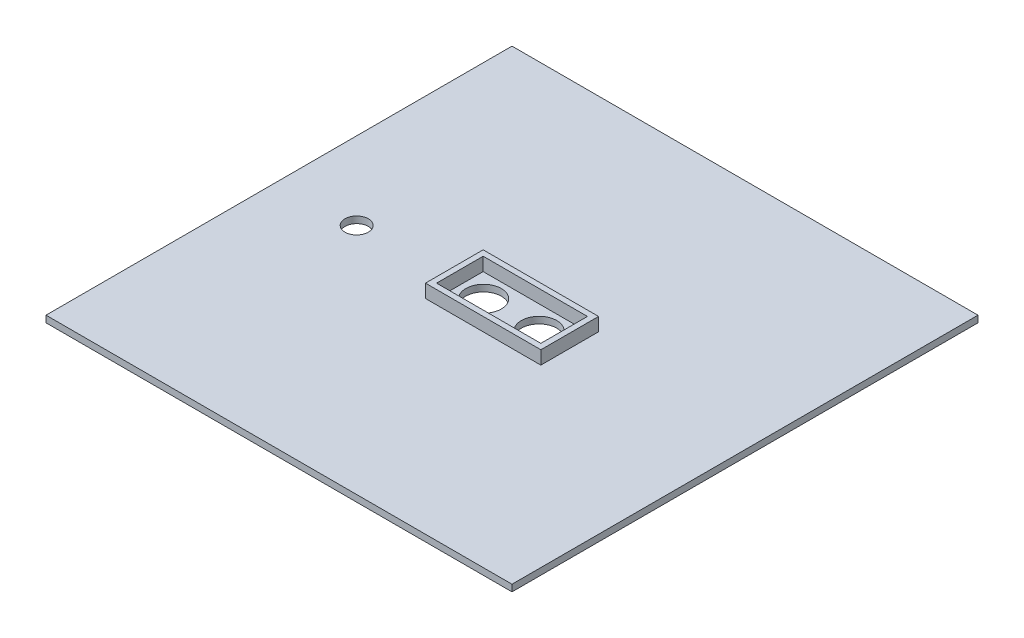
ISO-10303-21;
HEADER;
FILE_DESCRIPTION(('STEP AP214'),'2;1');
FILE_NAME('part.step','',(''),(''),'','','');
FILE_SCHEMA(('AUTOMOTIVE_DESIGN { 1 0 10303 214 1 1 1 1 }'));
ENDSEC;
DATA;
#1=APPLICATION_CONTEXT('core data for automotive mechanical design processes');
#2=APPLICATION_PROTOCOL_DEFINITION('international standard','automotive_design',2000,#1);
#3=PRODUCT_CONTEXT('',#1,'mechanical');
#4=PRODUCT('Part','Part','',(#3));
#5=PRODUCT_RELATED_PRODUCT_CATEGORY('part','',(#4));
#6=PRODUCT_DEFINITION_FORMATION('','',#4);
#7=PRODUCT_DEFINITION_CONTEXT('part definition',#1,'design');
#8=PRODUCT_DEFINITION('design','',#6,#7);
#9=PRODUCT_DEFINITION_SHAPE('','',#8);
#10=(LENGTH_UNIT() NAMED_UNIT(*) SI_UNIT(.MILLI.,.METRE.));
#11=(NAMED_UNIT(*) PLANE_ANGLE_UNIT() SI_UNIT($,.RADIAN.));
#12=(NAMED_UNIT(*) SI_UNIT($,.STERADIAN.) SOLID_ANGLE_UNIT());
#13=UNCERTAINTY_MEASURE_WITH_UNIT(LENGTH_MEASURE(1.E-05),#10,'distance_accuracy_value','');
#14=(GEOMETRIC_REPRESENTATION_CONTEXT(3) GLOBAL_UNCERTAINTY_ASSIGNED_CONTEXT((#13)) GLOBAL_UNIT_ASSIGNED_CONTEXT((#10,
#11,#12)) REPRESENTATION_CONTEXT('',''));
#15=CARTESIAN_POINT('',(0.,0.,0.));
#16=DIRECTION('',(0.,0.,1.));
#17=DIRECTION('',(1.,0.,0.));
#18=AXIS2_PLACEMENT_3D('',#15,#16,#17);
#19=CARTESIAN_POINT('',(0.,3.,0.));
#20=DIRECTION('',(0.,-1.,0.));
#21=DIRECTION('',(0.,0.,-1.));
#22=AXIS2_PLACEMENT_3D('',#19,#20,#21);
#23=PLANE('',#22);
#24=CARTESIAN_POINT('',(-70.,3.,0.));
#25=DIRECTION('',(0.,1.,0.));
#26=DIRECTION('',(0.,0.,1.));
#27=AXIS2_PLACEMENT_3D('',#24,#25,#26);
#28=CIRCLE('',#27,5.25);
#29=CARTESIAN_POINT('',(-70.,3.,5.25));
#30=VERTEX_POINT('',#29);
#31=EDGE_CURVE('E484',#30,#30,#28,.T.);
#32=ORIENTED_EDGE('',*,*,#31,.F.);
#33=EDGE_LOOP('',(#32));
#34=FACE_BOUND('',#33,.T.);
#35=DIRECTION('',(-1.,0.,0.));
#36=VECTOR('',#35,1.);
#37=CARTESIAN_POINT('',(-4.99999999999999,3.,-19.));
#38=LINE('',#37,#36);
#39=CARTESIAN_POINT('',(5.00000000000001,3.,-19.));
#40=VERTEX_POINT('',#39);
#41=CARTESIAN_POINT('',(-4.99999999999999,3.,-19.));
#42=VERTEX_POINT('',#41);
#43=EDGE_CURVE('E213',#40,#42,#38,.T.);
#44=ORIENTED_EDGE('',*,*,#43,.F.);
#45=DIRECTION('',(0.,0.,-1.));
#46=VECTOR('',#45,1.);
#47=CARTESIAN_POINT('',(5.00000000000001,3.,-15.));
#48=LINE('',#47,#46);
#49=CARTESIAN_POINT('',(5.00000000000001,3.,-15.));
#50=VERTEX_POINT('',#49);
#51=EDGE_CURVE('E55',#50,#40,#48,.T.);
#52=ORIENTED_EDGE('',*,*,#51,.F.);
#53=DIRECTION('',(1.,0.,0.));
#54=VECTOR('',#53,1.);
#55=CARTESIAN_POINT('',(-4.99999999999999,3.,-15.));
#56=LINE('',#55,#54);
#57=CARTESIAN_POINT('',(-4.99999999999999,3.,-15.));
#58=VERTEX_POINT('',#57);
#59=EDGE_CURVE('E220',#58,#50,#56,.T.);
#60=ORIENTED_EDGE('',*,*,#59,.F.);
#61=DIRECTION('',(0.,0.,1.));
#62=VECTOR('',#61,1.);
#63=CARTESIAN_POINT('',(-4.99999999999999,3.,-15.));
#64=LINE('',#63,#62);
#65=EDGE_CURVE('E203',#42,#58,#64,.T.);
#66=ORIENTED_EDGE('',*,*,#65,.F.);
#67=EDGE_LOOP('',(#44,#52,#60,#66));
#68=FACE_BOUND('',#67,.T.);
#69=DIRECTION('',(0.,0.,-1.));
#70=VECTOR('',#69,1.);
#71=CARTESIAN_POINT('',(105.,3.,105.));
#72=LINE('',#71,#70);
#73=CARTESIAN_POINT('',(105.,3.,105.));
#74=VERTEX_POINT('',#73);
#75=CARTESIAN_POINT('',(105.,3.,-105.));
#76=VERTEX_POINT('',#75);
#77=EDGE_CURVE('E419',#74,#76,#72,.T.);
#78=ORIENTED_EDGE('',*,*,#77,.T.);
#79=DIRECTION('',(-1.,0.,0.));
#80=VECTOR('',#79,1.);
#81=CARTESIAN_POINT('',(-105.,3.,-105.));
#82=LINE('',#81,#80);
#83=CARTESIAN_POINT('',(-105.,3.,-105.));
#84=VERTEX_POINT('',#83);
#85=EDGE_CURVE('E423',#76,#84,#82,.T.);
#86=ORIENTED_EDGE('',*,*,#85,.T.);
#87=DIRECTION('',(0.,0.,1.));
#88=VECTOR('',#87,1.);
#89=CARTESIAN_POINT('',(-105.,3.,105.));
#90=LINE('',#89,#88);
#91=CARTESIAN_POINT('',(-105.,3.,105.));
#92=VERTEX_POINT('',#91);
#93=EDGE_CURVE('E427',#84,#92,#90,.T.);
#94=ORIENTED_EDGE('',*,*,#93,.T.);
#95=DIRECTION('',(1.,0.,0.));
#96=VECTOR('',#95,1.);
#97=CARTESIAN_POINT('',(-105.,3.,105.));
#98=LINE('',#97,#96);
#99=EDGE_CURVE('E430',#92,#74,#98,.T.);
#100=ORIENTED_EDGE('',*,*,#99,.T.);
#101=EDGE_LOOP('',(#78,#86,#94,#100));
#102=FACE_BOUND('',#101,.T.);
#103=DIRECTION('',(0.,0.,-1.));
#104=VECTOR('',#103,1.);
#105=CARTESIAN_POINT('',(26.,3.,13.));
#106=LINE('',#105,#104);
#107=CARTESIAN_POINT('',(26.,3.,13.));
#108=VERTEX_POINT('',#107);
#109=CARTESIAN_POINT('',(26.,3.,-13.));
#110=VERTEX_POINT('',#109);
#111=EDGE_CURVE('E276',#108,#110,#106,.T.);
#112=ORIENTED_EDGE('',*,*,#111,.F.);
#113=DIRECTION('',(1.,0.,0.));
#114=VECTOR('',#113,1.);
#115=CARTESIAN_POINT('',(-26.,3.,13.));
#116=LINE('',#115,#114);
#117=CARTESIAN_POINT('',(-26.,3.,13.));
#118=VERTEX_POINT('',#117);
#119=EDGE_CURVE('E282',#118,#108,#116,.T.);
#120=ORIENTED_EDGE('',*,*,#119,.F.);
#121=DIRECTION('',(0.,0.,1.));
#122=VECTOR('',#121,1.);
#123=CARTESIAN_POINT('',(-26.,3.,13.));
#124=LINE('',#123,#122);
#125=CARTESIAN_POINT('',(-26.,3.,-13.));
#126=VERTEX_POINT('',#125);
#127=EDGE_CURVE('E299',#126,#118,#124,.T.);
#128=ORIENTED_EDGE('',*,*,#127,.F.);
#129=DIRECTION('',(-1.,0.,0.));
#130=VECTOR('',#129,1.);
#131=CARTESIAN_POINT('',(-26.,3.,-13.));
#132=LINE('',#131,#130);
#133=EDGE_CURVE('E295',#110,#126,#132,.T.);
#134=ORIENTED_EDGE('',*,*,#133,.F.);
#135=EDGE_LOOP('',(#112,#120,#128,#134));
#136=FACE_BOUND('',#135,.T.);
#137=ADVANCED_FACE('F38',(#34,#68,#102,#136),#23,.F.);
#138=CARTESIAN_POINT('',(0.,0.,0.));
#139=DIRECTION('',(0.,-1.,0.));
#140=DIRECTION('',(0.,0.,-1.));
#141=AXIS2_PLACEMENT_3D('',#138,#139,#140);
#142=PLANE('',#141);
#143=DIRECTION('',(0.,0.,-1.));
#144=VECTOR('',#143,1.);
#145=CARTESIAN_POINT('',(105.,0.,105.));
#146=LINE('',#145,#144);
#147=CARTESIAN_POINT('',(105.,0.,105.));
#148=VERTEX_POINT('',#147);
#149=CARTESIAN_POINT('',(105.,0.,-105.));
#150=VERTEX_POINT('',#149);
#151=EDGE_CURVE('E408',#148,#150,#146,.T.);
#152=ORIENTED_EDGE('',*,*,#151,.F.);
#153=DIRECTION('',(1.,0.,0.));
#154=VECTOR('',#153,1.);
#155=CARTESIAN_POINT('',(-105.,0.,105.));
#156=LINE('',#155,#154);
#157=CARTESIAN_POINT('',(-105.,0.,105.));
#158=VERTEX_POINT('',#157);
#159=EDGE_CURVE('E424',#158,#148,#156,.T.);
#160=ORIENTED_EDGE('',*,*,#159,.F.);
#161=DIRECTION('',(0.,0.,1.));
#162=VECTOR('',#161,1.);
#163=CARTESIAN_POINT('',(-105.,0.,105.));
#164=LINE('',#163,#162);
#165=CARTESIAN_POINT('',(-105.,0.,-105.));
#166=VERTEX_POINT('',#165);
#167=EDGE_CURVE('E440',#166,#158,#164,.T.);
#168=ORIENTED_EDGE('',*,*,#167,.F.);
#169=DIRECTION('',(-1.,0.,0.));
#170=VECTOR('',#169,1.);
#171=CARTESIAN_POINT('',(-105.,0.,-105.));
#172=LINE('',#171,#170);
#173=EDGE_CURVE('E437',#150,#166,#172,.T.);
#174=ORIENTED_EDGE('',*,*,#173,.F.);
#175=EDGE_LOOP('',(#152,#160,#168,#174));
#176=FACE_BOUND('',#175,.T.);
#177=DIRECTION('',(0.,0.,1.));
#178=VECTOR('',#177,1.);
#179=CARTESIAN_POINT('',(99.5,0.,0.));
#180=LINE('',#179,#178);
#181=CARTESIAN_POINT('',(99.5,0.,-99.5));
#182=VERTEX_POINT('',#181);
#183=CARTESIAN_POINT('',(99.5,0.,99.5));
#184=VERTEX_POINT('',#183);
#185=EDGE_CURVE('E382',#182,#184,#180,.T.);
#186=ORIENTED_EDGE('',*,*,#185,.F.);
#187=DIRECTION('',(1.,0.,0.));
#188=VECTOR('',#187,1.);
#189=CARTESIAN_POINT('',(0.,0.,-99.5));
#190=LINE('',#189,#188);
#191=CARTESIAN_POINT('',(-99.5,0.,-99.5));
#192=VERTEX_POINT('',#191);
#193=EDGE_CURVE('E378',#192,#182,#190,.T.);
#194=ORIENTED_EDGE('',*,*,#193,.F.);
#195=DIRECTION('',(0.,0.,1.));
#196=VECTOR('',#195,1.);
#197=CARTESIAN_POINT('',(-99.5,0.,0.));
#198=LINE('',#197,#196);
#199=CARTESIAN_POINT('',(-99.5,0.,99.5));
#200=VERTEX_POINT('',#199);
#201=EDGE_CURVE('E335',#192,#200,#198,.T.);
#202=ORIENTED_EDGE('',*,*,#201,.T.);
#203=DIRECTION('',(1.,0.,0.));
#204=VECTOR('',#203,1.);
#205=CARTESIAN_POINT('',(0.,0.,99.5));
#206=LINE('',#205,#204);
#207=EDGE_CURVE('E386',#200,#184,#206,.T.);
#208=ORIENTED_EDGE('',*,*,#207,.T.);
#209=EDGE_LOOP('',(#186,#194,#202,#208));
#210=FACE_BOUND('',#209,.T.);
#211=ADVANCED_FACE('F493',(#176,#210),#142,.T.);
#212=CARTESIAN_POINT('',(105.,3.,105.));
#213=DIRECTION('',(-1.,0.,0.));
#214=DIRECTION('',(0.,0.,1.));
#215=AXIS2_PLACEMENT_3D('',#212,#213,#214);
#216=PLANE('',#215);
#217=ORIENTED_EDGE('',*,*,#151,.T.);
#218=DIRECTION('',(0.,-1.,0.));
#219=VECTOR('',#218,1.);
#220=CARTESIAN_POINT('',(105.,3.,-105.));
#221=LINE('',#220,#219);
#222=EDGE_CURVE('E456',#76,#150,#221,.T.);
#223=ORIENTED_EDGE('',*,*,#222,.F.);
#224=ORIENTED_EDGE('',*,*,#77,.F.);
#225=DIRECTION('',(0.,-1.,0.));
#226=VECTOR('',#225,1.);
#227=CARTESIAN_POINT('',(105.,3.,105.));
#228=LINE('',#227,#226);
#229=EDGE_CURVE('E433',#74,#148,#228,.T.);
#230=ORIENTED_EDGE('',*,*,#229,.T.);
#231=EDGE_LOOP('',(#217,#223,#224,#230));
#232=FACE_BOUND('',#231,.T.);
#233=ADVANCED_FACE('F40',(#232),#216,.F.);
#234=CARTESIAN_POINT('',(-105.,3.,-105.));
#235=DIRECTION('',(0.,0.,1.));
#236=DIRECTION('',(1.,0.,0.));
#237=AXIS2_PLACEMENT_3D('',#234,#235,#236);
#238=PLANE('',#237);
#239=ORIENTED_EDGE('',*,*,#173,.T.);
#240=DIRECTION('',(0.,-1.,0.));
#241=VECTOR('',#240,1.);
#242=CARTESIAN_POINT('',(-105.,3.,-105.));
#243=LINE('',#242,#241);
#244=EDGE_CURVE('E452',#84,#166,#243,.T.);
#245=ORIENTED_EDGE('',*,*,#244,.F.);
#246=ORIENTED_EDGE('',*,*,#85,.F.);
#247=ORIENTED_EDGE('',*,*,#222,.T.);
#248=EDGE_LOOP('',(#239,#245,#246,#247));
#249=FACE_BOUND('',#248,.T.);
#250=ADVANCED_FACE('F747',(#249),#238,.F.);
#251=CARTESIAN_POINT('',(-105.,3.,105.));
#252=DIRECTION('',(1.,0.,0.));
#253=DIRECTION('',(0.,0.,-1.));
#254=AXIS2_PLACEMENT_3D('',#251,#252,#253);
#255=PLANE('',#254);
#256=ORIENTED_EDGE('',*,*,#167,.T.);
#257=DIRECTION('',(0.,-1.,0.));
#258=VECTOR('',#257,1.);
#259=CARTESIAN_POINT('',(-105.,3.,105.));
#260=LINE('',#259,#258);
#261=EDGE_CURVE('E448',#92,#158,#260,.T.);
#262=ORIENTED_EDGE('',*,*,#261,.F.);
#263=ORIENTED_EDGE('',*,*,#93,.F.);
#264=ORIENTED_EDGE('',*,*,#244,.T.);
#265=EDGE_LOOP('',(#256,#262,#263,#264));
#266=FACE_BOUND('',#265,.T.);
#267=ADVANCED_FACE('F515',(#266),#255,.F.);
#268=CARTESIAN_POINT('',(-105.,3.,105.));
#269=DIRECTION('',(0.,0.,-1.));
#270=DIRECTION('',(-1.,0.,0.));
#271=AXIS2_PLACEMENT_3D('',#268,#269,#270);
#272=PLANE('',#271);
#273=ORIENTED_EDGE('',*,*,#159,.T.);
#274=ORIENTED_EDGE('',*,*,#229,.F.);
#275=ORIENTED_EDGE('',*,*,#99,.F.);
#276=ORIENTED_EDGE('',*,*,#261,.T.);
#277=EDGE_LOOP('',(#273,#274,#275,#276));
#278=FACE_BOUND('',#277,.T.);
#279=ADVANCED_FACE('F506',(#278),#272,.F.);
#280=DIRECTION('',(1.,0.,0.));
#281=VECTOR('',#280,1.);
#282=CARTESIAN_POINT('',(-23.5,3.,10.5));
#283=LINE('',#282,#281);
#284=CARTESIAN_POINT('',(-23.5,3.,10.5));
#285=VERTEX_POINT('',#284);
#286=CARTESIAN_POINT('',(23.5,3.,10.5));
#287=VERTEX_POINT('',#286);
#288=EDGE_CURVE('E239',#285,#287,#283,.T.);
#289=ORIENTED_EDGE('',*,*,#288,.T.);
#290=DIRECTION('',(0.,0.,-1.));
#291=VECTOR('',#290,1.);
#292=CARTESIAN_POINT('',(23.5,3.,10.5));
#293=LINE('',#292,#291);
#294=CARTESIAN_POINT('',(23.5,3.,-10.5));
#295=VERTEX_POINT('',#294);
#296=EDGE_CURVE('E230',#287,#295,#293,.T.);
#297=ORIENTED_EDGE('',*,*,#296,.T.);
#298=DIRECTION('',(-1.,0.,0.));
#299=VECTOR('',#298,1.);
#300=CARTESIAN_POINT('',(-23.5,3.,-10.5));
#301=LINE('',#300,#299);
#302=CARTESIAN_POINT('',(-23.5,3.,-10.5));
#303=VERTEX_POINT('',#302);
#304=EDGE_CURVE('E253',#295,#303,#301,.T.);
#305=ORIENTED_EDGE('',*,*,#304,.T.);
#306=DIRECTION('',(0.,0.,1.));
#307=VECTOR('',#306,1.);
#308=CARTESIAN_POINT('',(-23.5,3.,10.5));
#309=LINE('',#308,#307);
#310=EDGE_CURVE('E257',#303,#285,#309,.T.);
#311=ORIENTED_EDGE('',*,*,#310,.T.);
#312=EDGE_LOOP('',(#289,#297,#305,#311));
#313=FACE_BOUND('',#312,.T.);
#314=CARTESIAN_POINT('',(-12.8052898635694,3.,0.));
#315=DIRECTION('',(0.,1.,0.));
#316=DIRECTION('',(0.,0.,1.));
#317=AXIS2_PLACEMENT_3D('',#314,#315,#316);
#318=CIRCLE('',#317,8.);
#319=CARTESIAN_POINT('',(-12.8052898635694,3.,8.));
#320=VERTEX_POINT('',#319);
#321=EDGE_CURVE('E322',#320,#320,#318,.T.);
#322=ORIENTED_EDGE('',*,*,#321,.F.);
#323=EDGE_LOOP('',(#322));
#324=FACE_BOUND('',#323,.T.);
#325=CARTESIAN_POINT('',(12.1947101364306,3.,0.));
#326=DIRECTION('',(0.,1.,0.));
#327=DIRECTION('',(0.,0.,1.));
#328=AXIS2_PLACEMENT_3D('',#325,#326,#327);
#329=CIRCLE('',#328,8.);
#330=CARTESIAN_POINT('',(12.1947101364306,3.,8.));
#331=VERTEX_POINT('',#330);
#332=EDGE_CURVE('E321',#331,#331,#329,.T.);
#333=ORIENTED_EDGE('',*,*,#332,.F.);
#334=EDGE_LOOP('',(#333));
#335=FACE_BOUND('',#334,.T.);
#336=ADVANCED_FACE('F495',(#313,#324,#335),#23,.F.);
#337=CARTESIAN_POINT('',(0.,-5.,-99.5));
#338=DIRECTION('',(0.,0.,1.));
#339=DIRECTION('',(1.,0.,0.));
#340=AXIS2_PLACEMENT_3D('',#337,#338,#339);
#341=PLANE('',#340);
#342=ORIENTED_EDGE('',*,*,#193,.T.);
#343=DIRECTION('',(0.,1.,0.));
#344=VECTOR('',#343,1.);
#345=CARTESIAN_POINT('',(99.5,-5.,-99.5));
#346=LINE('',#345,#344);
#347=CARTESIAN_POINT('',(99.5,-5.,-99.5));
#348=VERTEX_POINT('',#347);
#349=EDGE_CURVE('E404',#348,#182,#346,.T.);
#350=ORIENTED_EDGE('',*,*,#349,.F.);
#351=DIRECTION('',(1.,0.,0.));
#352=VECTOR('',#351,1.);
#353=CARTESIAN_POINT('',(0.,-5.,-99.5));
#354=LINE('',#353,#352);
#355=CARTESIAN_POINT('',(-99.5,-5.,-99.5));
#356=VERTEX_POINT('',#355);
#357=EDGE_CURVE('E345',#356,#348,#354,.T.);
#358=ORIENTED_EDGE('',*,*,#357,.F.);
#359=DIRECTION('',(0.,1.,0.));
#360=VECTOR('',#359,1.);
#361=CARTESIAN_POINT('',(-99.5,-5.,-99.5));
#362=LINE('',#361,#360);
#363=EDGE_CURVE('E391',#356,#192,#362,.T.);
#364=ORIENTED_EDGE('',*,*,#363,.T.);
#365=EDGE_LOOP('',(#342,#350,#358,#364));
#366=FACE_BOUND('',#365,.T.);
#367=ADVANCED_FACE('F505',(#366),#341,.F.);
#368=CARTESIAN_POINT('',(99.5,-5.,0.));
#369=DIRECTION('',(-1.,0.,0.));
#370=DIRECTION('',(0.,0.,1.));
#371=AXIS2_PLACEMENT_3D('',#368,#369,#370);
#372=PLANE('',#371);
#373=ORIENTED_EDGE('',*,*,#185,.T.);
#374=DIRECTION('',(0.,1.,0.));
#375=VECTOR('',#374,1.);
#376=CARTESIAN_POINT('',(99.5,-5.,99.5));
#377=LINE('',#376,#375);
#378=CARTESIAN_POINT('',(99.5,-5.,99.5));
#379=VERTEX_POINT('',#378);
#380=EDGE_CURVE('E400',#379,#184,#377,.T.);
#381=ORIENTED_EDGE('',*,*,#380,.F.);
#382=DIRECTION('',(0.,0.,1.));
#383=VECTOR('',#382,1.);
#384=CARTESIAN_POINT('',(99.5,-5.,0.));
#385=LINE('',#384,#383);
#386=EDGE_CURVE('E349',#348,#379,#385,.T.);
#387=ORIENTED_EDGE('',*,*,#386,.F.);
#388=ORIENTED_EDGE('',*,*,#349,.T.);
#389=EDGE_LOOP('',(#373,#381,#387,#388));
#390=FACE_BOUND('',#389,.T.);
#391=ADVANCED_FACE('F512',(#390),#372,.F.);
#392=CARTESIAN_POINT('',(0.,-5.,99.5));
#393=DIRECTION('',(0.,0.,1.));
#394=DIRECTION('',(1.,0.,0.));
#395=AXIS2_PLACEMENT_3D('',#392,#393,#394);
#396=PLANE('',#395);
#397=ORIENTED_EDGE('',*,*,#207,.F.);
#398=DIRECTION('',(0.,1.,0.));
#399=VECTOR('',#398,1.);
#400=CARTESIAN_POINT('',(-99.5,-5.,99.5));
#401=LINE('',#400,#399);
#402=CARTESIAN_POINT('',(-99.5,-5.,99.5));
#403=VERTEX_POINT('',#402);
#404=EDGE_CURVE('E395',#403,#200,#401,.T.);
#405=ORIENTED_EDGE('',*,*,#404,.F.);
#406=DIRECTION('',(1.,0.,0.));
#407=VECTOR('',#406,1.);
#408=CARTESIAN_POINT('',(0.,-5.,99.5));
#409=LINE('',#408,#407);
#410=EDGE_CURVE('E352',#403,#379,#409,.T.);
#411=ORIENTED_EDGE('',*,*,#410,.T.);
#412=ORIENTED_EDGE('',*,*,#380,.T.);
#413=EDGE_LOOP('',(#397,#405,#411,#412));
#414=FACE_BOUND('',#413,.T.);
#415=ADVANCED_FACE('F548',(#414),#396,.T.);
#416=CARTESIAN_POINT('',(96.4999999999999,-5.,0.));
#417=DIRECTION('',(-1.,0.,0.));
#418=DIRECTION('',(0.,0.,1.));
#419=AXIS2_PLACEMENT_3D('',#416,#417,#418);
#420=PLANE('',#419);
#421=DIRECTION('',(0.,0.,1.));
#422=VECTOR('',#421,1.);
#423=CARTESIAN_POINT('',(96.4999999999999,0.,0.));
#424=LINE('',#423,#422);
#425=CARTESIAN_POINT('',(96.4999999999999,0.,-96.5));
#426=VERTEX_POINT('',#425);
#427=CARTESIAN_POINT('',(96.4999999999999,0.,96.5));
#428=VERTEX_POINT('',#427);
#429=EDGE_CURVE('E361',#426,#428,#424,.T.);
#430=ORIENTED_EDGE('',*,*,#429,.F.);
#431=DIRECTION('',(0.,1.,0.));
#432=VECTOR('',#431,1.);
#433=CARTESIAN_POINT('',(96.4999999999999,-5.,-96.5));
#434=LINE('',#433,#432);
#435=CARTESIAN_POINT('',(96.4999999999999,-5.,-96.5));
#436=VERTEX_POINT('',#435);
#437=EDGE_CURVE('E396',#436,#426,#434,.T.);
#438=ORIENTED_EDGE('',*,*,#437,.F.);
#439=DIRECTION('',(0.,0.,1.));
#440=VECTOR('',#439,1.);
#441=CARTESIAN_POINT('',(96.4999999999999,-5.,0.));
#442=LINE('',#441,#440);
#443=CARTESIAN_POINT('',(96.4999999999999,-5.,96.5));
#444=VERTEX_POINT('',#443);
#445=EDGE_CURVE('E330',#436,#444,#442,.T.);
#446=ORIENTED_EDGE('',*,*,#445,.T.);
#447=DIRECTION('',(0.,1.,0.));
#448=VECTOR('',#447,1.);
#449=CARTESIAN_POINT('',(96.4999999999999,-5.,96.5));
#450=LINE('',#449,#448);
#451=EDGE_CURVE('E360',#444,#428,#450,.T.);
#452=ORIENTED_EDGE('',*,*,#451,.T.);
#453=EDGE_LOOP('',(#430,#438,#446,#452));
#454=FACE_BOUND('',#453,.T.);
#455=ADVANCED_FACE('F551',(#454),#420,.T.);
#456=CARTESIAN_POINT('',(0.,-5.,-96.5));
#457=DIRECTION('',(0.,0.,1.));
#458=DIRECTION('',(1.,0.,0.));
#459=AXIS2_PLACEMENT_3D('',#456,#457,#458);
#460=PLANE('',#459);
#461=DIRECTION('',(1.,0.,0.));
#462=VECTOR('',#461,1.);
#463=CARTESIAN_POINT('',(0.,0.,-96.5));
#464=LINE('',#463,#462);
#465=CARTESIAN_POINT('',(-96.5000000000001,0.,-96.5));
#466=VERTEX_POINT('',#465);
#467=EDGE_CURVE('E365',#466,#426,#464,.T.);
#468=ORIENTED_EDGE('',*,*,#467,.F.);
#469=DIRECTION('',(0.,1.,0.));
#470=VECTOR('',#469,1.);
#471=CARTESIAN_POINT('',(-96.5000000000001,-5.,-96.5));
#472=LINE('',#471,#470);
#473=CARTESIAN_POINT('',(-96.5000000000001,-5.,-96.5));
#474=VERTEX_POINT('',#473);
#475=EDGE_CURVE('E414',#474,#466,#472,.T.);
#476=ORIENTED_EDGE('',*,*,#475,.F.);
#477=DIRECTION('',(1.,0.,0.));
#478=VECTOR('',#477,1.);
#479=CARTESIAN_POINT('',(0.,-5.,-96.5));
#480=LINE('',#479,#478);
#481=EDGE_CURVE('E334',#474,#436,#480,.T.);
#482=ORIENTED_EDGE('',*,*,#481,.T.);
#483=ORIENTED_EDGE('',*,*,#437,.T.);
#484=EDGE_LOOP('',(#468,#476,#482,#483));
#485=FACE_BOUND('',#484,.T.);
#486=ADVANCED_FACE('F562',(#485),#460,.T.);
#487=CARTESIAN_POINT('',(-96.5000000000001,-5.,0.));
#488=DIRECTION('',(-1.,0.,0.));
#489=DIRECTION('',(0.,0.,1.));
#490=AXIS2_PLACEMENT_3D('',#487,#488,#489);
#491=PLANE('',#490);
#492=DIRECTION('',(0.,0.,1.));
#493=VECTOR('',#492,1.);
#494=CARTESIAN_POINT('',(-96.5000000000001,0.,0.));
#495=LINE('',#494,#493);
#496=CARTESIAN_POINT('',(-96.5000000000001,0.,96.5));
#497=VERTEX_POINT('',#496);
#498=EDGE_CURVE('E370',#466,#497,#495,.T.);
#499=ORIENTED_EDGE('',*,*,#498,.T.);
#500=DIRECTION('',(0.,1.,0.));
#501=VECTOR('',#500,1.);
#502=CARTESIAN_POINT('',(-96.5000000000001,-5.,96.5));
#503=LINE('',#502,#501);
#504=CARTESIAN_POINT('',(-96.5000000000001,-5.,96.5));
#505=VERTEX_POINT('',#504);
#506=EDGE_CURVE('E411',#505,#497,#503,.T.);
#507=ORIENTED_EDGE('',*,*,#506,.F.);
#508=DIRECTION('',(0.,0.,1.));
#509=VECTOR('',#508,1.);
#510=CARTESIAN_POINT('',(-96.5000000000001,-5.,0.));
#511=LINE('',#510,#509);
#512=EDGE_CURVE('E339',#474,#505,#511,.T.);
#513=ORIENTED_EDGE('',*,*,#512,.F.);
#514=ORIENTED_EDGE('',*,*,#475,.T.);
#515=EDGE_LOOP('',(#499,#507,#513,#514));
#516=FACE_BOUND('',#515,.T.);
#517=ADVANCED_FACE('F558',(#516),#491,.F.);
#518=CARTESIAN_POINT('',(0.,-5.,96.5));
#519=DIRECTION('',(0.,0.,1.));
#520=DIRECTION('',(1.,0.,0.));
#521=AXIS2_PLACEMENT_3D('',#518,#519,#520);
#522=PLANE('',#521);
#523=DIRECTION('',(1.,0.,0.));
#524=VECTOR('',#523,1.);
#525=CARTESIAN_POINT('',(0.,0.,96.5));
#526=LINE('',#525,#524);
#527=EDGE_CURVE('E374',#497,#428,#526,.T.);
#528=ORIENTED_EDGE('',*,*,#527,.T.);
#529=ORIENTED_EDGE('',*,*,#451,.F.);
#530=DIRECTION('',(1.,0.,0.));
#531=VECTOR('',#530,1.);
#532=CARTESIAN_POINT('',(0.,-5.,96.5));
#533=LINE('',#532,#531);
#534=EDGE_CURVE('E342',#505,#444,#533,.T.);
#535=ORIENTED_EDGE('',*,*,#534,.F.);
#536=ORIENTED_EDGE('',*,*,#506,.T.);
#537=EDGE_LOOP('',(#528,#529,#535,#536));
#538=FACE_BOUND('',#537,.T.);
#539=ADVANCED_FACE('F546',(#538),#522,.F.);
#540=CARTESIAN_POINT('',(-99.5,-5.,0.));
#541=DIRECTION('',(-1.,0.,0.));
#542=DIRECTION('',(0.,0.,1.));
#543=AXIS2_PLACEMENT_3D('',#540,#541,#542);
#544=PLANE('',#543);
#545=ORIENTED_EDGE('',*,*,#201,.F.);
#546=ORIENTED_EDGE('',*,*,#363,.F.);
#547=DIRECTION('',(0.,0.,1.));
#548=VECTOR('',#547,1.);
#549=CARTESIAN_POINT('',(-99.5,-5.,0.));
#550=LINE('',#549,#548);
#551=EDGE_CURVE('E356',#356,#403,#550,.T.);
#552=ORIENTED_EDGE('',*,*,#551,.T.);
#553=ORIENTED_EDGE('',*,*,#404,.T.);
#554=EDGE_LOOP('',(#545,#546,#552,#553));
#555=FACE_BOUND('',#554,.T.);
#556=ADVANCED_FACE('F542',(#555),#544,.T.);
#557=CARTESIAN_POINT('',(0.,-5.,0.));
#558=DIRECTION('',(0.,-1.,0.));
#559=DIRECTION('',(0.,0.,-1.));
#560=AXIS2_PLACEMENT_3D('',#557,#558,#559);
#561=PLANE('',#560);
#562=ORIENTED_EDGE('',*,*,#445,.F.);
#563=ORIENTED_EDGE('',*,*,#481,.F.);
#564=ORIENTED_EDGE('',*,*,#512,.T.);
#565=ORIENTED_EDGE('',*,*,#534,.T.);
#566=EDGE_LOOP('',(#562,#563,#564,#565));
#567=FACE_BOUND('',#566,.T.);
#568=ORIENTED_EDGE('',*,*,#357,.T.);
#569=ORIENTED_EDGE('',*,*,#386,.T.);
#570=ORIENTED_EDGE('',*,*,#410,.F.);
#571=ORIENTED_EDGE('',*,*,#551,.F.);
#572=EDGE_LOOP('',(#568,#569,#570,#571));
#573=FACE_BOUND('',#572,.T.);
#574=ADVANCED_FACE('F536',(#567,#573),#561,.T.);
#575=CARTESIAN_POINT('',(-70.,0.,0.));
#576=DIRECTION('',(0.,-1.,0.));
#577=DIRECTION('',(0.,0.,-1.));
#578=AXIS2_PLACEMENT_3D('',#575,#576,#577);
#579=CIRCLE('',#578,5.25);
#580=CARTESIAN_POINT('',(-70.,0.,-5.25));
#581=VERTEX_POINT('',#580);
#582=EDGE_CURVE('E42',#581,#581,#579,.T.);
#583=ORIENTED_EDGE('',*,*,#582,.F.);
#584=EDGE_LOOP('',(#583));
#585=FACE_BOUND('',#584,.T.);
#586=DIRECTION('',(0.,0.,1.));
#587=VECTOR('',#586,1.);
#588=CARTESIAN_POINT('',(5.00000000000001,0.,0.));
#589=LINE('',#588,#587);
#590=CARTESIAN_POINT('',(5.00000000000001,0.,-19.));
#591=VERTEX_POINT('',#590);
#592=CARTESIAN_POINT('',(5.00000000000001,0.,-15.));
#593=VERTEX_POINT('',#592);
#594=EDGE_CURVE('E11',#591,#593,#589,.T.);
#595=ORIENTED_EDGE('',*,*,#594,.F.);
#596=DIRECTION('',(1.,0.,0.));
#597=VECTOR('',#596,1.);
#598=CARTESIAN_POINT('',(0.,0.,-19.));
#599=LINE('',#598,#597);
#600=CARTESIAN_POINT('',(-4.99999999999999,0.,-19.));
#601=VERTEX_POINT('',#600);
#602=EDGE_CURVE('E460',#601,#591,#599,.T.);
#603=ORIENTED_EDGE('',*,*,#602,.F.);
#604=DIRECTION('',(0.,0.,-1.));
#605=VECTOR('',#604,1.);
#606=CARTESIAN_POINT('',(-4.99999999999999,0.,0.));
#607=LINE('',#606,#605);
#608=CARTESIAN_POINT('',(-4.99999999999999,0.,-15.));
#609=VERTEX_POINT('',#608);
#610=EDGE_CURVE('E206',#609,#601,#607,.T.);
#611=ORIENTED_EDGE('',*,*,#610,.F.);
#612=DIRECTION('',(-1.,0.,0.));
#613=VECTOR('',#612,1.);
#614=CARTESIAN_POINT('',(0.,0.,-15.));
#615=LINE('',#614,#613);
#616=EDGE_CURVE('E48',#593,#609,#615,.T.);
#617=ORIENTED_EDGE('',*,*,#616,.F.);
#618=EDGE_LOOP('',(#595,#603,#611,#617));
#619=FACE_BOUND('',#618,.T.);
#620=CARTESIAN_POINT('',(-12.8052898635694,0.,0.));
#621=DIRECTION('',(0.,-1.,0.));
#622=DIRECTION('',(0.,0.,-1.));
#623=AXIS2_PLACEMENT_3D('',#620,#621,#622);
#624=CIRCLE('',#623,8.);
#625=CARTESIAN_POINT('',(-12.8052898635694,0.,-8.));
#626=VERTEX_POINT('',#625);
#627=EDGE_CURVE('E366',#626,#626,#624,.T.);
#628=ORIENTED_EDGE('',*,*,#627,.F.);
#629=EDGE_LOOP('',(#628));
#630=FACE_BOUND('',#629,.T.);
#631=CARTESIAN_POINT('',(12.1947101364306,0.,0.));
#632=DIRECTION('',(0.,-1.,0.));
#633=DIRECTION('',(0.,0.,-1.));
#634=AXIS2_PLACEMENT_3D('',#631,#632,#633);
#635=CIRCLE('',#634,8.);
#636=CARTESIAN_POINT('',(12.1947101364306,0.,-8.));
#637=VERTEX_POINT('',#636);
#638=EDGE_CURVE('E326',#637,#637,#635,.T.);
#639=ORIENTED_EDGE('',*,*,#638,.F.);
#640=EDGE_LOOP('',(#639));
#641=FACE_BOUND('',#640,.T.);
#642=ORIENTED_EDGE('',*,*,#429,.T.);
#643=ORIENTED_EDGE('',*,*,#527,.F.);
#644=ORIENTED_EDGE('',*,*,#498,.F.);
#645=ORIENTED_EDGE('',*,*,#467,.T.);
#646=EDGE_LOOP('',(#642,#643,#644,#645));
#647=FACE_BOUND('',#646,.T.);
#648=ADVANCED_FACE('F478',(#585,#619,#630,#641,#647),#142,.T.);
#649=CARTESIAN_POINT('',(12.1947101364306,-5.,0.));
#650=DIRECTION('',(0.,1.,0.));
#651=DIRECTION('',(0.,0.,1.));
#652=AXIS2_PLACEMENT_3D('',#649,#650,#651);
#653=CYLINDRICAL_SURFACE('',#652,8.);
#654=ORIENTED_EDGE('',*,*,#638,.T.);
#655=EDGE_LOOP('',(#654));
#656=FACE_BOUND('',#655,.T.);
#657=ORIENTED_EDGE('',*,*,#332,.T.);
#658=EDGE_LOOP('',(#657));
#659=FACE_BOUND('',#658,.T.);
#660=ADVANCED_FACE('F524',(#656,#659),#653,.F.);
#661=CARTESIAN_POINT('',(-12.8052898635694,-5.,0.));
#662=DIRECTION('',(0.,1.,0.));
#663=DIRECTION('',(0.,0.,1.));
#664=AXIS2_PLACEMENT_3D('',#661,#662,#663);
#665=CYLINDRICAL_SURFACE('',#664,8.);
#666=ORIENTED_EDGE('',*,*,#627,.T.);
#667=EDGE_LOOP('',(#666));
#668=FACE_BOUND('',#667,.T.);
#669=ORIENTED_EDGE('',*,*,#321,.T.);
#670=EDGE_LOOP('',(#669));
#671=FACE_BOUND('',#670,.T.);
#672=ADVANCED_FACE('F526',(#668,#671),#665,.F.);
#673=CARTESIAN_POINT('',(0.,9.,0.));
#674=DIRECTION('',(0.,-1.,0.));
#675=DIRECTION('',(0.,0.,-1.));
#676=AXIS2_PLACEMENT_3D('',#673,#674,#675);
#677=PLANE('',#676);
#678=DIRECTION('',(0.,0.,-1.));
#679=VECTOR('',#678,1.);
#680=CARTESIAN_POINT('',(26.,9.,13.));
#681=LINE('',#680,#679);
#682=CARTESIAN_POINT('',(26.,9.,13.));
#683=VERTEX_POINT('',#682);
#684=CARTESIAN_POINT('',(26.,9.,-13.));
#685=VERTEX_POINT('',#684);
#686=EDGE_CURVE('E277',#683,#685,#681,.T.);
#687=ORIENTED_EDGE('',*,*,#686,.T.);
#688=DIRECTION('',(-1.,0.,0.));
#689=VECTOR('',#688,1.);
#690=CARTESIAN_POINT('',(-26.,9.,-13.));
#691=LINE('',#690,#689);
#692=CARTESIAN_POINT('',(-26.,9.,-13.));
#693=VERTEX_POINT('',#692);
#694=EDGE_CURVE('E281',#685,#693,#691,.T.);
#695=ORIENTED_EDGE('',*,*,#694,.T.);
#696=DIRECTION('',(0.,0.,1.));
#697=VECTOR('',#696,1.);
#698=CARTESIAN_POINT('',(-26.,9.,13.));
#699=LINE('',#698,#697);
#700=CARTESIAN_POINT('',(-26.,9.,13.));
#701=VERTEX_POINT('',#700);
#702=EDGE_CURVE('E285',#693,#701,#699,.T.);
#703=ORIENTED_EDGE('',*,*,#702,.T.);
#704=DIRECTION('',(1.,0.,0.));
#705=VECTOR('',#704,1.);
#706=CARTESIAN_POINT('',(-26.,9.,13.));
#707=LINE('',#706,#705);
#708=EDGE_CURVE('E288',#701,#683,#707,.T.);
#709=ORIENTED_EDGE('',*,*,#708,.T.);
#710=EDGE_LOOP('',(#687,#695,#703,#709));
#711=FACE_BOUND('',#710,.T.);
#712=DIRECTION('',(0.,0.,-1.));
#713=VECTOR('',#712,1.);
#714=CARTESIAN_POINT('',(23.5,9.,10.5));
#715=LINE('',#714,#713);
#716=CARTESIAN_POINT('',(23.5,9.,10.5));
#717=VERTEX_POINT('',#716);
#718=CARTESIAN_POINT('',(23.5,9.,-10.5));
#719=VERTEX_POINT('',#718);
#720=EDGE_CURVE('E235',#717,#719,#715,.T.);
#721=ORIENTED_EDGE('',*,*,#720,.F.);
#722=DIRECTION('',(1.,0.,0.));
#723=VECTOR('',#722,1.);
#724=CARTESIAN_POINT('',(-23.5,9.,10.5));
#725=LINE('',#724,#723);
#726=CARTESIAN_POINT('',(-23.5,9.,10.5));
#727=VERTEX_POINT('',#726);
#728=EDGE_CURVE('E246',#727,#717,#725,.T.);
#729=ORIENTED_EDGE('',*,*,#728,.F.);
#730=DIRECTION('',(0.,0.,1.));
#731=VECTOR('',#730,1.);
#732=CARTESIAN_POINT('',(-23.5,9.,10.5));
#733=LINE('',#732,#731);
#734=CARTESIAN_POINT('',(-23.5,9.,-10.5));
#735=VERTEX_POINT('',#734);
#736=EDGE_CURVE('E242',#735,#727,#733,.T.);
#737=ORIENTED_EDGE('',*,*,#736,.F.);
#738=DIRECTION('',(-1.,0.,0.));
#739=VECTOR('',#738,1.);
#740=CARTESIAN_POINT('',(-23.5,9.,-10.5));
#741=LINE('',#740,#739);
#742=EDGE_CURVE('E238',#719,#735,#741,.T.);
#743=ORIENTED_EDGE('',*,*,#742,.F.);
#744=EDGE_LOOP('',(#721,#729,#737,#743));
#745=FACE_BOUND('',#744,.T.);
#746=ADVANCED_FACE('F533',(#711,#745),#677,.F.);
#747=CARTESIAN_POINT('',(26.,9.,13.));
#748=DIRECTION('',(-1.,0.,0.));
#749=DIRECTION('',(0.,0.,1.));
#750=AXIS2_PLACEMENT_3D('',#747,#748,#749);
#751=PLANE('',#750);
#752=ORIENTED_EDGE('',*,*,#111,.T.);
#753=DIRECTION('',(0.,-1.,0.));
#754=VECTOR('',#753,1.);
#755=CARTESIAN_POINT('',(26.,9.,-13.));
#756=LINE('',#755,#754);
#757=EDGE_CURVE('E317',#685,#110,#756,.T.);
#758=ORIENTED_EDGE('',*,*,#757,.F.);
#759=ORIENTED_EDGE('',*,*,#686,.F.);
#760=DIRECTION('',(0.,-1.,0.));
#761=VECTOR('',#760,1.);
#762=CARTESIAN_POINT('',(26.,9.,13.));
#763=LINE('',#762,#761);
#764=EDGE_CURVE('E291',#683,#108,#763,.T.);
#765=ORIENTED_EDGE('',*,*,#764,.T.);
#766=EDGE_LOOP('',(#752,#758,#759,#765));
#767=FACE_BOUND('',#766,.T.);
#768=ADVANCED_FACE('F706',(#767),#751,.F.);
#769=CARTESIAN_POINT('',(-26.,9.,-13.));
#770=DIRECTION('',(0.,0.,1.));
#771=DIRECTION('',(1.,0.,0.));
#772=AXIS2_PLACEMENT_3D('',#769,#770,#771);
#773=PLANE('',#772);
#774=ORIENTED_EDGE('',*,*,#133,.T.);
#775=DIRECTION('',(0.,-1.,0.));
#776=VECTOR('',#775,1.);
#777=CARTESIAN_POINT('',(-26.,9.,-13.));
#778=LINE('',#777,#776);
#779=EDGE_CURVE('E313',#693,#126,#778,.T.);
#780=ORIENTED_EDGE('',*,*,#779,.F.);
#781=ORIENTED_EDGE('',*,*,#694,.F.);
#782=ORIENTED_EDGE('',*,*,#757,.T.);
#783=EDGE_LOOP('',(#774,#780,#781,#782));
#784=FACE_BOUND('',#783,.T.);
#785=ADVANCED_FACE('F698',(#784),#773,.F.);
#786=CARTESIAN_POINT('',(-26.,9.,13.));
#787=DIRECTION('',(1.,0.,0.));
#788=DIRECTION('',(0.,0.,-1.));
#789=AXIS2_PLACEMENT_3D('',#786,#787,#788);
#790=PLANE('',#789);
#791=ORIENTED_EDGE('',*,*,#127,.T.);
#792=DIRECTION('',(0.,-1.,0.));
#793=VECTOR('',#792,1.);
#794=CARTESIAN_POINT('',(-26.,9.,13.));
#795=LINE('',#794,#793);
#796=EDGE_CURVE('E309',#701,#118,#795,.T.);
#797=ORIENTED_EDGE('',*,*,#796,.F.);
#798=ORIENTED_EDGE('',*,*,#702,.F.);
#799=ORIENTED_EDGE('',*,*,#779,.T.);
#800=EDGE_LOOP('',(#791,#797,#798,#799));
#801=FACE_BOUND('',#800,.T.);
#802=ADVANCED_FACE('F690',(#801),#790,.F.);
#803=CARTESIAN_POINT('',(-26.,9.,13.));
#804=DIRECTION('',(0.,0.,-1.));
#805=DIRECTION('',(-1.,0.,0.));
#806=AXIS2_PLACEMENT_3D('',#803,#804,#805);
#807=PLANE('',#806);
#808=ORIENTED_EDGE('',*,*,#119,.T.);
#809=ORIENTED_EDGE('',*,*,#764,.F.);
#810=ORIENTED_EDGE('',*,*,#708,.F.);
#811=ORIENTED_EDGE('',*,*,#796,.T.);
#812=EDGE_LOOP('',(#808,#809,#810,#811));
#813=FACE_BOUND('',#812,.T.);
#814=ADVANCED_FACE('F682',(#813),#807,.F.);
#815=CARTESIAN_POINT('',(23.5,9.,10.5));
#816=DIRECTION('',(-1.,0.,0.));
#817=DIRECTION('',(0.,0.,1.));
#818=AXIS2_PLACEMENT_3D('',#815,#816,#817);
#819=PLANE('',#818);
#820=ORIENTED_EDGE('',*,*,#296,.F.);
#821=DIRECTION('',(0.,-1.,0.));
#822=VECTOR('',#821,1.);
#823=CARTESIAN_POINT('',(23.5,9.,10.5));
#824=LINE('',#823,#822);
#825=EDGE_CURVE('E249',#717,#287,#824,.T.);
#826=ORIENTED_EDGE('',*,*,#825,.F.);
#827=ORIENTED_EDGE('',*,*,#720,.T.);
#828=DIRECTION('',(0.,-1.,0.));
#829=VECTOR('',#828,1.);
#830=CARTESIAN_POINT('',(23.5,9.,-10.5));
#831=LINE('',#830,#829);
#832=EDGE_CURVE('E272',#719,#295,#831,.T.);
#833=ORIENTED_EDGE('',*,*,#832,.T.);
#834=EDGE_LOOP('',(#820,#826,#827,#833));
#835=FACE_BOUND('',#834,.T.);
#836=ADVANCED_FACE('F674',(#835),#819,.T.);
#837=CARTESIAN_POINT('',(-23.5,9.,-10.5));
#838=DIRECTION('',(0.,0.,1.));
#839=DIRECTION('',(1.,0.,0.));
#840=AXIS2_PLACEMENT_3D('',#837,#838,#839);
#841=PLANE('',#840);
#842=ORIENTED_EDGE('',*,*,#304,.F.);
#843=ORIENTED_EDGE('',*,*,#832,.F.);
#844=ORIENTED_EDGE('',*,*,#742,.T.);
#845=DIRECTION('',(0.,-1.,0.));
#846=VECTOR('',#845,1.);
#847=CARTESIAN_POINT('',(-23.5,9.,-10.5));
#848=LINE('',#847,#846);
#849=EDGE_CURVE('E269',#735,#303,#848,.T.);
#850=ORIENTED_EDGE('',*,*,#849,.T.);
#851=EDGE_LOOP('',(#842,#843,#844,#850));
#852=FACE_BOUND('',#851,.T.);
#853=ADVANCED_FACE('F666',(#852),#841,.T.);
#854=CARTESIAN_POINT('',(-23.5,9.,10.5));
#855=DIRECTION('',(1.,0.,0.));
#856=DIRECTION('',(0.,0.,-1.));
#857=AXIS2_PLACEMENT_3D('',#854,#855,#856);
#858=PLANE('',#857);
#859=ORIENTED_EDGE('',*,*,#310,.F.);
#860=ORIENTED_EDGE('',*,*,#849,.F.);
#861=ORIENTED_EDGE('',*,*,#736,.T.);
#862=DIRECTION('',(0.,-1.,0.));
#863=VECTOR('',#862,1.);
#864=CARTESIAN_POINT('',(-23.5,9.,10.5));
#865=LINE('',#864,#863);
#866=EDGE_CURVE('E266',#727,#285,#865,.T.);
#867=ORIENTED_EDGE('',*,*,#866,.T.);
#868=EDGE_LOOP('',(#859,#860,#861,#867));
#869=FACE_BOUND('',#868,.T.);
#870=ADVANCED_FACE('F658',(#869),#858,.T.);
#871=CARTESIAN_POINT('',(-23.5,9.,10.5));
#872=DIRECTION('',(0.,0.,-1.));
#873=DIRECTION('',(-1.,0.,0.));
#874=AXIS2_PLACEMENT_3D('',#871,#872,#873);
#875=PLANE('',#874);
#876=ORIENTED_EDGE('',*,*,#288,.F.);
#877=ORIENTED_EDGE('',*,*,#866,.F.);
#878=ORIENTED_EDGE('',*,*,#728,.T.);
#879=ORIENTED_EDGE('',*,*,#825,.T.);
#880=EDGE_LOOP('',(#876,#877,#878,#879));
#881=FACE_BOUND('',#880,.T.);
#882=ADVANCED_FACE('F651',(#881),#875,.T.);
#883=CARTESIAN_POINT('',(5.00000000000001,-5.,-15.));
#884=DIRECTION('',(1.,0.,0.));
#885=DIRECTION('',(0.,0.,-1.));
#886=AXIS2_PLACEMENT_3D('',#883,#884,#885);
#887=PLANE('',#886);
#888=ORIENTED_EDGE('',*,*,#594,.T.);
#889=DIRECTION('',(0.,1.,0.));
#890=VECTOR('',#889,1.);
#891=CARTESIAN_POINT('',(5.00000000000001,-5.,-15.));
#892=LINE('',#891,#890);
#893=EDGE_CURVE('E227',#593,#50,#892,.T.);
#894=ORIENTED_EDGE('',*,*,#893,.T.);
#895=ORIENTED_EDGE('',*,*,#51,.T.);
#896=DIRECTION('',(0.,1.,0.));
#897=VECTOR('',#896,1.);
#898=CARTESIAN_POINT('',(5.00000000000001,-5.,-19.));
#899=LINE('',#898,#897);
#900=EDGE_CURVE('E210',#591,#40,#899,.T.);
#901=ORIENTED_EDGE('',*,*,#900,.F.);
#902=EDGE_LOOP('',(#888,#894,#895,#901));
#903=FACE_BOUND('',#902,.T.);
#904=ADVANCED_FACE('F480',(#903),#887,.F.);
#905=CARTESIAN_POINT('',(-4.99999999999999,-5.,-15.));
#906=DIRECTION('',(0.,0.,1.));
#907=DIRECTION('',(1.,0.,0.));
#908=AXIS2_PLACEMENT_3D('',#905,#906,#907);
#909=PLANE('',#908);
#910=ORIENTED_EDGE('',*,*,#616,.T.);
#911=DIRECTION('',(0.,1.,0.));
#912=VECTOR('',#911,1.);
#913=CARTESIAN_POINT('',(-4.99999999999999,-5.,-15.));
#914=LINE('',#913,#912);
#915=EDGE_CURVE('E209',#609,#58,#914,.T.);
#916=ORIENTED_EDGE('',*,*,#915,.T.);
#917=ORIENTED_EDGE('',*,*,#59,.T.);
#918=ORIENTED_EDGE('',*,*,#893,.F.);
#919=EDGE_LOOP('',(#910,#916,#917,#918));
#920=FACE_BOUND('',#919,.T.);
#921=ADVANCED_FACE('F475',(#920),#909,.F.);
#922=CARTESIAN_POINT('',(-4.99999999999999,-5.,-15.));
#923=DIRECTION('',(-1.,0.,0.));
#924=DIRECTION('',(0.,0.,1.));
#925=AXIS2_PLACEMENT_3D('',#922,#923,#924);
#926=PLANE('',#925);
#927=ORIENTED_EDGE('',*,*,#610,.T.);
#928=DIRECTION('',(0.,1.,0.));
#929=VECTOR('',#928,1.);
#930=CARTESIAN_POINT('',(-4.99999999999999,-5.,-19.));
#931=LINE('',#930,#929);
#932=EDGE_CURVE('E63',#601,#42,#931,.T.);
#933=ORIENTED_EDGE('',*,*,#932,.T.);
#934=ORIENTED_EDGE('',*,*,#65,.T.);
#935=ORIENTED_EDGE('',*,*,#915,.F.);
#936=EDGE_LOOP('',(#927,#933,#934,#935));
#937=FACE_BOUND('',#936,.T.);
#938=ADVANCED_FACE('F200',(#937),#926,.F.);
#939=CARTESIAN_POINT('',(-4.99999999999999,-5.,-19.));
#940=DIRECTION('',(0.,0.,-1.));
#941=DIRECTION('',(-1.,0.,0.));
#942=AXIS2_PLACEMENT_3D('',#939,#940,#941);
#943=PLANE('',#942);
#944=ORIENTED_EDGE('',*,*,#602,.T.);
#945=ORIENTED_EDGE('',*,*,#900,.T.);
#946=ORIENTED_EDGE('',*,*,#43,.T.);
#947=ORIENTED_EDGE('',*,*,#932,.F.);
#948=EDGE_LOOP('',(#944,#945,#946,#947));
#949=FACE_BOUND('',#948,.T.);
#950=ADVANCED_FACE('F214',(#949),#943,.F.);
#951=CARTESIAN_POINT('',(-70.,-5.,0.));
#952=DIRECTION('',(0.,1.,0.));
#953=DIRECTION('',(0.,0.,1.));
#954=AXIS2_PLACEMENT_3D('',#951,#952,#953);
#955=CYLINDRICAL_SURFACE('',#954,5.25);
#956=ORIENTED_EDGE('',*,*,#582,.T.);
#957=EDGE_LOOP('',(#956));
#958=FACE_BOUND('',#957,.T.);
#959=ORIENTED_EDGE('',*,*,#31,.T.);
#960=EDGE_LOOP('',(#959));
#961=FACE_BOUND('',#960,.T.);
#962=ADVANCED_FACE('F490',(#958,#961),#955,.F.);
#963=CLOSED_SHELL('',(#137,#211,#233,#250,#267,#279,#336,#367,#391,#415,#455,#486,#517,#539,
#556,#574,#648,#660,#672,#746,#768,#785,#802,#814,#836,#853,#870,#882,#904,#921,#938,#950,#962));
#964=MANIFOLD_SOLID_BREP('B2',#963);
#965=ADVANCED_BREP_SHAPE_REPRESENTATION('',(#18,#964),#14);
#966=SHAPE_DEFINITION_REPRESENTATION(#9,#965);
ENDSEC;
END-ISO-10303-21;
